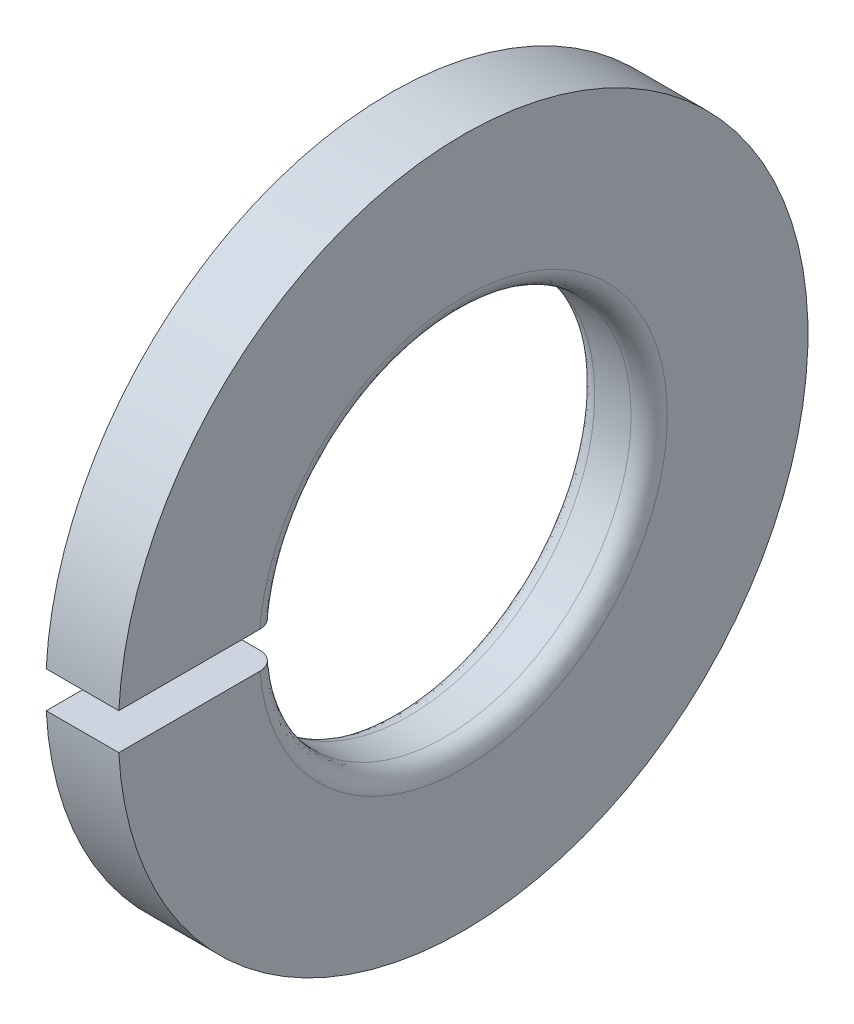
ISO-10303-21;
HEADER;
FILE_DESCRIPTION(('STEP AP214'),'2;1');
FILE_NAME('part.step','',(''),(''),'','','');
FILE_SCHEMA(('AUTOMOTIVE_DESIGN { 1 0 10303 214 1 1 1 1 }'));
ENDSEC;
DATA;
#1=APPLICATION_CONTEXT('core data for automotive mechanical design processes');
#2=APPLICATION_PROTOCOL_DEFINITION('international standard','automotive_design',2000,#1);
#3=PRODUCT_CONTEXT('',#1,'mechanical');
#4=PRODUCT('Part','Part','',(#3));
#5=PRODUCT_RELATED_PRODUCT_CATEGORY('part','',(#4));
#6=PRODUCT_DEFINITION_FORMATION('','',#4);
#7=PRODUCT_DEFINITION_CONTEXT('part definition',#1,'design');
#8=PRODUCT_DEFINITION('design','',#6,#7);
#9=PRODUCT_DEFINITION_SHAPE('','',#8);
#10=(LENGTH_UNIT() NAMED_UNIT(*) SI_UNIT(.MILLI.,.METRE.));
#11=(NAMED_UNIT(*) PLANE_ANGLE_UNIT() SI_UNIT($,.RADIAN.));
#12=(NAMED_UNIT(*) SI_UNIT($,.STERADIAN.) SOLID_ANGLE_UNIT());
#13=UNCERTAINTY_MEASURE_WITH_UNIT(LENGTH_MEASURE(1.E-05),#10,'distance_accuracy_value','');
#14=(GEOMETRIC_REPRESENTATION_CONTEXT(3) GLOBAL_UNCERTAINTY_ASSIGNED_CONTEXT((#13)) GLOBAL_UNIT_ASSIGNED_CONTEXT((#10,
#11,#12)) REPRESENTATION_CONTEXT('',''));
#15=CARTESIAN_POINT('',(0.,0.,0.));
#16=DIRECTION('',(0.,0.,1.));
#17=DIRECTION('',(1.,0.,0.));
#18=AXIS2_PLACEMENT_3D('',#15,#16,#17);
#19=CARTESIAN_POINT('',(-0.2,0.,0.));
#20=DIRECTION('',(-1.,0.,0.));
#21=DIRECTION('',(0.,0.,1.));
#22=AXIS2_PLACEMENT_3D('',#19,#20,#21);
#23=CYLINDRICAL_SURFACE('',#22,2.05);
#24=DIRECTION('',(-1.,0.,0.));
#25=VECTOR('',#24,1.);
#26=CARTESIAN_POINT('',(-0.4,-0.200000000674253,2.04022057624422));
#27=LINE('',#26,#25);
#28=CARTESIAN_POINT('',(-0.600000000000003,-0.200000000337126,2.04022057627727));
#29=VERTEX_POINT('',#28);
#30=CARTESIAN_POINT('',(-0.199999999999999,-0.200000000337126,2.04022057627727));
#31=VERTEX_POINT('',#30);
#32=EDGE_CURVE('E59',#29,#31,#27,.F.);
#33=ORIENTED_EDGE('',*,*,#32,.T.);
#34=CARTESIAN_POINT('',(-0.199999999999999,0.,0.));
#35=DIRECTION('',(-1.,0.,0.));
#36=DIRECTION('',(0.,0.,1.));
#37=AXIS2_PLACEMENT_3D('',#34,#35,#36);
#38=CIRCLE('',#37,2.05);
#39=CARTESIAN_POINT('',(-0.199999999999999,0.200000000153928,2.04022057629523));
#40=VERTEX_POINT('',#39);
#41=EDGE_CURVE('E69',#40,#31,#38,.T.);
#42=ORIENTED_EDGE('',*,*,#41,.F.);
#43=DIRECTION('',(1.,0.,0.));
#44=VECTOR('',#43,1.);
#45=CARTESIAN_POINT('',(-0.4,0.200000000307857,2.04022057628014));
#46=LINE('',#45,#44);
#47=CARTESIAN_POINT('',(-0.600000000074826,0.200000000153928,2.04022057616246));
#48=VERTEX_POINT('',#47);
#49=EDGE_CURVE('E64',#40,#48,#46,.F.);
#50=ORIENTED_EDGE('',*,*,#49,.T.);
#51=CARTESIAN_POINT('',(-0.600000000000003,0.,0.));
#52=DIRECTION('',(-1.,0.,0.));
#53=DIRECTION('',(0.,0.,1.));
#54=AXIS2_PLACEMENT_3D('',#51,#52,#53);
#55=CIRCLE('',#54,2.05);
#56=EDGE_CURVE('E21',#29,#48,#55,.F.);
#57=ORIENTED_EDGE('',*,*,#56,.F.);
#58=EDGE_LOOP('',(#33,#42,#50,#57));
#59=FACE_BOUND('',#58,.T.);
#60=ADVANCED_FACE('F16',(#59),#23,.F.);
#61=CARTESIAN_POINT('',(-0.580033317,0.107372646,2.048186685));
#62=CARTESIAN_POINT('',(-0.580033317,3.99856242,1.844197789));
#63=CARTESIAN_POINT('',(-0.580033317,3.896532989,-2.050999167));
#64=CARTESIAN_POINT('',(-0.580033317,0.,-2.050999167));
#65=CARTESIAN_POINT('',(-0.580033317,-3.896532989,-2.050999167));
#66=CARTESIAN_POINT('',(-0.580033317,-3.99856242,1.844197789));
#67=CARTESIAN_POINT('',(-0.580033317,-0.107372646,2.048186685));
#68=CARTESIAN_POINT('',(-0.716010753,0.106658403,2.034562142));
#69=CARTESIAN_POINT('',(-0.716010753,3.971963973,1.831930181));
#70=CARTESIAN_POINT('',(-0.716010753,3.870613242,-2.037355915));
#71=CARTESIAN_POINT('',(-0.716010753,0.,-2.037355915));
#72=CARTESIAN_POINT('',(-0.716010753,-3.870613242,-2.037355915));
#73=CARTESIAN_POINT('',(-0.716010753,-3.971963973,1.831930181));
#74=CARTESIAN_POINT('',(-0.716010753,-0.106658403,2.034562142));
#75=CARTESIAN_POINT('',(-0.812644085,0.111717291,2.131062963));
#76=CARTESIAN_POINT('',(-0.812644085,4.160357228,1.918820014));
#77=CARTESIAN_POINT('',(-0.812644085,4.054199354,-2.133989247));
#78=CARTESIAN_POINT('',(-0.812644085,0.,-2.133989247));
#79=CARTESIAN_POINT('',(-0.812644085,-4.054199354,-2.133989247));
#80=CARTESIAN_POINT('',(-0.812644085,-4.160357228,1.918820014));
#81=CARTESIAN_POINT('',(-0.812644085,-0.111717291,2.131062963));
#82=CARTESIAN_POINT('',(-0.799000833,0.118835898,2.266853937));
#83=CARTESIAN_POINT('',(-0.799000833,4.425454491,2.041086903));
#84=CARTESIAN_POINT('',(-0.799000833,4.312532256,-2.269966683));
#85=CARTESIAN_POINT('',(-0.799000833,0.,-2.269966683));
#86=CARTESIAN_POINT('',(-0.799000833,-4.312532256,-2.269966683));
#87=CARTESIAN_POINT('',(-0.799000833,-4.425454491,2.041086903));
#88=CARTESIAN_POINT('',(-0.799000833,-0.118835898,2.266853937));
#89=(BOUNDED_SURFACE() B_SPLINE_SURFACE(3,3,((#61,#62,#63,#64,#65,#66,#67),(#68,#69,#70,#71,#72,
#73,#74),(#75,#76,#77,#78,#79,#80,#81),(#82,#83,#84,#85,#86,#87,#88)),.UNSPECIFIED.,.F.,.F.,
.F.) B_SPLINE_SURFACE_WITH_KNOTS((4,4),(4,3,4),(0.,1.),(0.,0.5,1.),
.UNSPECIFIED.) GEOMETRIC_REPRESENTATION_ITEM() RATIONAL_B_SPLINE_SURFACE(((1.,0.350789780215431,
0.350789780215431,1.,0.350789780215431,0.350789780215431,1.),(0.755320871117959,
0.264958842371597,0.264958842371597,0.755320871117959,0.264958842371597,0.264958842371597,
0.755320871117959),(0.755320871117959,0.264958842371597,0.264958842371597,0.755320871117959,
0.264958842371597,0.264958842371597,0.755320871117959),(1.,0.350789780215431,0.350789780215431,
1.,0.350789780215431,0.350789780215431,1.))) REPRESENTATION_ITEM('') SURFACE());
#90=CARTESIAN_POINT('',(-0.800000000011606,0.117790614492978,2.24691463337642));
#91=CARTESIAN_POINT('',(-0.800000000011607,4.3865280832893,2.02313345182409));
#92=CARTESIAN_POINT('',(-0.800000000011607,4.27459911496978,-2.24999999962598));
#93=CARTESIAN_POINT('',(-0.800000000011606,0.,-2.24999999962598));
#94=CARTESIAN_POINT('',(-0.800000000011607,-4.27459911496978,-2.24999999962598));
#95=CARTESIAN_POINT('',(-0.800000000011607,-4.3865280832893,2.02313345182409));
#96=CARTESIAN_POINT('',(-0.800000000011606,-0.117790614492978,2.24691463337642));
#97=(BOUNDED_CURVE() B_SPLINE_CURVE(3,(#90,#91,#92,#93,#94,#95,#96),.UNSPECIFIED.,.F.,
.F.) B_SPLINE_CURVE_WITH_KNOTS((4,3,4),(0.,0.5,1.),
.UNSPECIFIED.) CURVE() GEOMETRIC_REPRESENTATION_ITEM() RATIONAL_B_SPLINE_CURVE((0.956578302165992,
0.335557892375659,0.335557892375659,0.956578302165992,0.335557892375659,0.335557892375659,0.956578302165992)) REPRESENTATION_ITEM(''));
#98=CARTESIAN_POINT('',(-0.800000000004642,0.200000001463602,2.2410934830574));
#99=VERTEX_POINT('',#98);
#100=CARTESIAN_POINT('',(-0.800000000004642,-0.200000001463602,2.2410934830574));
#101=VERTEX_POINT('',#100);
#102=EDGE_CURVE('E95',#99,#101,#97,.T.);
#103=CARTESIAN_POINT('',(-0.800000000011606,-0.2,2.2410934830574));
#104=CARTESIAN_POINT('',(-0.800009380586033,-0.199999999999992,2.22975892295394));
#105=CARTESIAN_POINT('',(-0.799044625498886,-0.199999999999996,2.21842707761932));
#106=CARTESIAN_POINT('',(-0.795236578345557,-0.200000000000004,2.19609110441703));
#107=CARTESIAN_POINT('',(-0.792394568560642,-0.200000000000008,2.18508675820541));
#108=CARTESIAN_POINT('',(-0.784899682227042,-0.199999999999992,2.16370635476711));
#109=CARTESIAN_POINT('',(-0.780245893178928,-0.199999999999973,2.15333061718592));
#110=CARTESIAN_POINT('',(-0.769261427341696,-0.200000000000027,2.1335110976004));
#111=CARTESIAN_POINT('',(-0.762931087375522,-0.200000000000102,2.12406712892404));
#112=CARTESIAN_POINT('',(-0.748779665680255,-0.199999999999919,2.10639256306883));
#113=CARTESIAN_POINT('',(-0.740960651674507,-0.199999999999662,2.09816031064719));
#114=CARTESIAN_POINT('',(-0.724046583349223,-0.200000000000338,2.08313205676974));
#115=CARTESIAN_POINT('',(-0.714951597324807,-0.200000000001272,2.07633597849292));
#116=CARTESIAN_POINT('',(-0.695780628589884,-0.200000000001267,2.06440051765539));
#117=CARTESIAN_POINT('',(-0.685708397878414,-0.200000000000336,2.05925510172876));
#118=CARTESIAN_POINT('',(-0.664842681734056,-0.199999999999664,2.05073950165837));
#119=CARTESIAN_POINT('',(-0.654049672079823,-0.199999999999922,2.0473681592676));
#120=CARTESIAN_POINT('',(-0.635988100638602,-0.200000000000049,2.04336664836853));
#121=CARTESIAN_POINT('',(-0.62883642124079,-0.200000000000025,2.04218759083578));
#122=CARTESIAN_POINT('',(-0.614457531604958,-0.199999999999975,2.04061467862908));
#123=CARTESIAN_POINT('',(-0.607230442982398,-0.199999999999951,2.04021971182569));
#124=CARTESIAN_POINT('',(-0.60000000014965,-0.2,2.04022057604478));
#125=B_SPLINE_CURVE_WITH_KNOTS('',3,(#103,#104,#105,#106,#107,#108,#109,#110,#111,#112,#113,
#114,#115,#116,#117,#118,#119,#120,#121,#122,#123,#124),.UNSPECIFIED.,.F.,.F.,(4,2,2,2,2,2,2,2,
2,2,4),(0.,0.0339588559577191,0.0678945398666436,0.101847337580276,0.13579331926613,
0.169692490514159,0.203589848034817,0.237361856441742,0.271111788530929,0.292816611636757,
0.314490627251309),.UNSPECIFIED.);
#126=EDGE_CURVE('E82',#101,#29,#125,.T.);
#127=CARTESIAN_POINT('',(-0.60000000014965,0.2,2.04022057604478));
#128=CARTESIAN_POINT('',(-0.611213909457987,0.199999999999997,2.04021077519078));
#129=CARTESIAN_POINT('',(-0.622424615497118,0.199999999999998,2.04116764000537));
#130=CARTESIAN_POINT('',(-0.644518092358117,0.200000000000002,2.04494195310485));
#131=CARTESIAN_POINT('',(-0.65540115803218,0.200000000000003,2.0477576728358));
#132=CARTESIAN_POINT('',(-0.67654434962043,0.199999999999997,2.05517878927597));
#133=CARTESIAN_POINT('',(-0.68680420578501,0.199999999999988,2.05978495466734));
#134=CARTESIAN_POINT('',(-0.70640604369611,0.200000000000012,2.07064933392915));
#135=CARTESIAN_POINT('',(-0.715748148567725,0.200000000000043,2.07690732577483));
#136=CARTESIAN_POINT('',(-0.733275218600097,0.200000000000006,2.09091265094623));
#137=CARTESIAN_POINT('',(-0.741457465212266,0.199999999999936,2.098663386032));
#138=CARTESIAN_POINT('',(-0.756411664005744,0.200000000000064,2.11542335985753));
#139=CARTESIAN_POINT('',(-0.763183587003915,0.200000000000262,2.124432624633));
#140=CARTESIAN_POINT('',(-0.775158014487504,0.200000000000266,2.14349811162961));
#141=CARTESIAN_POINT('',(-0.780352993290512,0.200000000000071,2.15355905543216));
#142=CARTESIAN_POINT('',(-0.788984604287231,0.199999999999929,2.17440629699856));
#143=CARTESIAN_POINT('',(-0.792422171619997,0.199999999999983,2.18519220553573));
#144=CARTESIAN_POINT('',(-0.796617458847842,0.200000000000011,2.20354834557991));
#145=CARTESIAN_POINT('',(-0.797885078988491,0.200000000000006,2.21100609621852));
#146=CARTESIAN_POINT('',(-0.799576268230461,0.199999999999994,2.22600604365994));
#147=CARTESIAN_POINT('',(-0.800001021732336,0.199999999999989,2.23354810696728));
#148=CARTESIAN_POINT('',(-0.800000000011606,0.2,2.2410934830574));
#149=B_SPLINE_CURVE_WITH_KNOTS('',3,(#127,#128,#129,#130,#131,#132,#133,#134,#135,#136,#137,
#138,#139,#140,#141,#142,#143,#144,#145,#146,#147,#148),.UNSPECIFIED.,.F.,.F.,(4,2,2,2,2,2,2,2,
2,2,4),(0.,0.0335963217129075,0.067161446043312,0.100740996647746,0.134316036065029,
0.167968513692015,0.201621687604119,0.235433027798897,0.269226357811702,0.291875956380084,
0.314493705013647),.UNSPECIFIED.);
#150=EDGE_CURVE('E76',#48,#99,#149,.T.);
#151=ORIENTED_EDGE('',*,*,#102,.T.);
#152=ORIENTED_EDGE('',*,*,#126,.T.);
#153=ORIENTED_EDGE('',*,*,#56,.T.);
#154=ORIENTED_EDGE('',*,*,#150,.T.);
#155=EDGE_LOOP('',(#151,#152,#153,#154));
#156=FACE_BOUND('',#155,.T.);
#157=ADVANCED_FACE('F84',(#156),#89,.T.);
#158=CARTESIAN_POINT('',(-0.000999167000000001,0.118835898,2.266853937));
#159=CARTESIAN_POINT('',(-0.000999167000000001,4.425454491,2.041086903));
#160=CARTESIAN_POINT('',(-0.000999167000000001,4.312532256,-2.269966683));
#161=CARTESIAN_POINT('',(-0.000999167000000001,0.,-2.269966683));
#162=CARTESIAN_POINT('',(-0.000999167000000001,-4.312532256,-2.269966683));
#163=CARTESIAN_POINT('',(-0.000999167000000001,-4.425454491,2.041086903));
#164=CARTESIAN_POINT('',(-0.000999167000000001,-0.118835898,2.266853937));
#165=CARTESIAN_POINT('',(0.012644085,0.111717291,2.131062963));
#166=CARTESIAN_POINT('',(0.012644085,4.160357228,1.918820014));
#167=CARTESIAN_POINT('',(0.012644085,4.054199354,-2.133989247));
#168=CARTESIAN_POINT('',(0.012644085,0.,-2.133989247));
#169=CARTESIAN_POINT('',(0.012644085,-4.054199354,-2.133989247));
#170=CARTESIAN_POINT('',(0.012644085,-4.160357228,1.918820014));
#171=CARTESIAN_POINT('',(0.012644085,-0.111717291,2.131062963));
#172=CARTESIAN_POINT('',(-0.083989247,0.106658403,2.034562142));
#173=CARTESIAN_POINT('',(-0.083989247,3.971963973,1.831930181));
#174=CARTESIAN_POINT('',(-0.083989247,3.870613242,-2.037355915));
#175=CARTESIAN_POINT('',(-0.083989247,0.,-2.037355915));
#176=CARTESIAN_POINT('',(-0.083989247,-3.870613242,-2.037355915));
#177=CARTESIAN_POINT('',(-0.083989247,-3.971963973,1.831930181));
#178=CARTESIAN_POINT('',(-0.083989247,-0.106658403,2.034562142));
#179=CARTESIAN_POINT('',(-0.219966683,0.107372646,2.048186685));
#180=CARTESIAN_POINT('',(-0.219966683,3.99856242,1.844197789));
#181=CARTESIAN_POINT('',(-0.219966683,3.896532989,-2.050999167));
#182=CARTESIAN_POINT('',(-0.219966683,0.,-2.050999167));
#183=CARTESIAN_POINT('',(-0.219966683,-3.896532989,-2.050999167));
#184=CARTESIAN_POINT('',(-0.219966683,-3.99856242,1.844197789));
#185=CARTESIAN_POINT('',(-0.219966683,-0.107372646,2.048186685));
#186=(BOUNDED_SURFACE() B_SPLINE_SURFACE(3,3,((#158,#159,#160,#161,#162,#163,#164),(#165,#166,
#167,#168,#169,#170,#171),(#172,#173,#174,#175,#176,#177,#178),(#179,#180,#181,#182,#183,#184,
#185)),.UNSPECIFIED.,.F.,.F.,.F.) B_SPLINE_SURFACE_WITH_KNOTS((4,4),(4,3,4),(0.,1.),(0.,0.5,1.),
.UNSPECIFIED.) GEOMETRIC_REPRESENTATION_ITEM() RATIONAL_B_SPLINE_SURFACE(((1.,0.350789780215431,
0.350789780215431,1.,0.350789780215431,0.350789780215431,1.),(0.755320871117974,
0.264958842371602,0.264958842371602,0.755320871117974,0.264958842371602,0.264958842371602,
0.755320871117974),(0.755320871117974,0.264958842371602,0.264958842371602,0.755320871117974,
0.264958842371602,0.264958842371602,0.755320871117974),(1.,0.350789780215431,0.350789780215431,
1.,0.350789780215431,0.350789780215431,1.))) REPRESENTATION_ITEM('') SURFACE());
#187=CARTESIAN_POINT('',(1.16062016502921E-11,-0.199999999999999,2.24109348315148));
#188=CARTESIAN_POINT('',(9.38059132239464E-06,-0.199999999999984,2.22975892304799));
#189=CARTESIAN_POINT('',(-0.000955374490542313,-0.199999999999992,2.21842707771289));
#190=CARTESIAN_POINT('',(-0.00476342163346842,-0.200000000000008,2.19609110450876));
#191=CARTESIAN_POINT('',(-0.00760543141326144,-0.200000000000016,2.18508675829579));
#192=CARTESIAN_POINT('',(-0.0151003177369134,-0.199999999999984,2.16370635485396));
#193=CARTESIAN_POINT('',(-0.0197541067802001,-0.199999999999945,2.15333061727057));
#194=CARTESIAN_POINT('',(-0.0307385726082152,-0.200000000000055,2.13351109767988));
#195=CARTESIAN_POINT('',(-0.0370689125699999,-0.200000000000205,2.12406712900054));
#196=CARTESIAN_POINT('',(-0.051220334257065,-0.199999999999838,2.10639256313867));
#197=CARTESIAN_POINT('',(-0.0590393482590025,-0.199999999999324,2.09816031071334));
#198=CARTESIAN_POINT('',(-0.0759534165773405,-0.200000000000676,2.08313205682792));
#199=CARTESIAN_POINT('',(-0.0850484025986199,-0.200000000002544,2.07633597854682));
#200=CARTESIAN_POINT('',(-0.104219371328054,-0.200000000002535,2.06440051770028));
#201=CARTESIAN_POINT('',(-0.114291602037168,-0.200000000000673,2.05925510176891));
#202=CARTESIAN_POINT('',(-0.135157318177666,-0.199999999999328,2.05073950168871));
#203=CARTESIAN_POINT('',(-0.145950327830398,-0.199999999999844,2.04736815929287));
#204=CARTESIAN_POINT('',(-0.164011899284985,-0.200000000000099,2.043366648382));
#205=CARTESIAN_POINT('',(-0.171163578697742,-0.20000000000005,2.04218759084421));
#206=CARTESIAN_POINT('',(-0.185542468364025,-0.19999999999995,2.04061467863077));
#207=CARTESIAN_POINT('',(-0.192769557002092,-0.199999999999901,2.04021971182568));
#208=CARTESIAN_POINT('',(-0.199999999850351,-0.200000000000001,2.04022057604478));
#209=B_SPLINE_CURVE_WITH_KNOTS('',3,(#187,#188,#189,#190,#191,#192,#193,#194,#195,#196,#197,
#198,#199,#200,#201,#202,#203,#204,#205,#206,#207,#208),.UNSPECIFIED.,.F.,.F.,(4,2,2,2,2,2,2,2,
2,2,4),(0.,0.0339588559578118,0.067894539866816,0.101847337580524,0.135793319266466,
0.169692490514643,0.203589848035453,0.237361856442534,0.271111788531991,0.292816611684237,
0.314490627345246),.UNSPECIFIED.);
#210=CARTESIAN_POINT('',(4.64248130664176E-12,-0.200000002172402,2.24109348315148));
#211=VERTEX_POINT('',#210);
#212=EDGE_CURVE('E176',#211,#31,#209,.T.);
#213=CARTESIAN_POINT('',(1.16062031834229E-11,-0.117790614492978,2.24691463337642));
#214=CARTESIAN_POINT('',(1.16062031743743E-11,-4.3865280832893,2.02313345182409));
#215=CARTESIAN_POINT('',(1.16062031743743E-11,-4.27459911496978,-2.24999999962598));
#216=CARTESIAN_POINT('',(1.16062031834229E-11,0.,-2.24999999962598));
#217=CARTESIAN_POINT('',(1.16062031743743E-11,4.27459911496978,-2.24999999962598));
#218=CARTESIAN_POINT('',(1.16062031743743E-11,4.3865280832893,2.02313345182409));
#219=CARTESIAN_POINT('',(1.16062031834229E-11,0.117790614492978,2.24691463337642));
#220=(BOUNDED_CURVE() B_SPLINE_CURVE(3,(#213,#214,#215,#216,#217,#218,#219),.UNSPECIFIED.,.F.,
.F.) B_SPLINE_CURVE_WITH_KNOTS((4,3,4),(0.,0.5,1.),
.UNSPECIFIED.) CURVE() GEOMETRIC_REPRESENTATION_ITEM() RATIONAL_B_SPLINE_CURVE((0.956578302165994,
0.335557892375659,0.335557892375659,0.956578302165994,0.335557892375659,0.335557892375659,0.956578302165994)) REPRESENTATION_ITEM(''));
#221=CARTESIAN_POINT('',(4.64248130664176E-12,0.200000001463602,2.2410934830574));
#222=VERTEX_POINT('',#221);
#223=EDGE_CURVE('E185',#211,#222,#220,.T.);
#224=CARTESIAN_POINT('',(1.16062023035901E-11,0.2,2.2410934830574));
#225=CARTESIAN_POINT('',(9.38058603285607E-06,0.199999999999992,2.22975892295394));
#226=CARTESIAN_POINT('',(-0.000955374501114946,0.199999999999996,2.21842707761931));
#227=CARTESIAN_POINT('',(-0.0047634216544488,0.200000000000004,2.196091104417));
#228=CARTESIAN_POINT('',(-0.00760543143936731,0.200000000000008,2.18508675820537));
#229=CARTESIAN_POINT('',(-0.0151003177729766,0.199999999999992,2.16370635476707));
#230=CARTESIAN_POINT('',(-0.0197541068210951,0.199999999999972,2.15333061718587));
#231=CARTESIAN_POINT('',(-0.03073857265834,0.200000000000028,2.13351109760034));
#232=CARTESIAN_POINT('',(-0.0370689126245222,0.200000000000102,2.12406712892398));
#233=CARTESIAN_POINT('',(-0.0512203343198005,0.199999999999919,2.10639256306877));
#234=CARTESIAN_POINT('',(-0.0590393483255508,0.199999999999662,2.09816031064713));
#235=CARTESIAN_POINT('',(-0.075953416650841,0.200000000000338,2.08313205676969));
#236=CARTESIAN_POINT('',(-0.0850484026752595,0.200000000001272,2.07633597849287));
#237=CARTESIAN_POINT('',(-0.104219371410188,0.200000000001267,2.06440051765536));
#238=CARTESIAN_POINT('',(-0.114291602121659,0.200000000000336,2.05925510172873));
#239=CARTESIAN_POINT('',(-0.135157318266021,0.199999999999664,2.05073950165834));
#240=CARTESIAN_POINT('',(-0.145950327920256,0.199999999999923,2.04736815926758));
#241=CARTESIAN_POINT('',(-0.164011899361465,0.20000000000005,2.04336664836852));
#242=CARTESIAN_POINT('',(-0.171163578759265,0.200000000000025,2.04218759083578));
#243=CARTESIAN_POINT('',(-0.18554246839507,0.199999999999975,2.04061467862908));
#244=CARTESIAN_POINT('',(-0.192769557017617,0.19999999999995,2.04021971182569));
#245=CARTESIAN_POINT('',(-0.199999999850351,0.2,2.04022057604478));
#246=B_SPLINE_CURVE_WITH_KNOTS('',3,(#224,#225,#226,#227,#228,#229,#230,#231,#232,#233,#234,
#235,#236,#237,#238,#239,#240,#241,#242,#243,#244,#245),.UNSPECIFIED.,.F.,.F.,(4,2,2,2,2,2,2,2,
2,2,4),(0.,0.0339588559577397,0.0678945398666848,0.101847337580337,0.135793319266211,
0.16969249051424,0.203589848034898,0.237361856441822,0.27111178853101,0.292816611636798,
0.314490627251309),.UNSPECIFIED.);
#247=EDGE_CURVE('E209',#222,#40,#246,.T.);
#248=ORIENTED_EDGE('',*,*,#41,.T.);
#249=ORIENTED_EDGE('',*,*,#212,.F.);
#250=ORIENTED_EDGE('',*,*,#223,.T.);
#251=ORIENTED_EDGE('',*,*,#247,.T.);
#252=EDGE_LOOP('',(#248,#249,#250,#251));
#253=FACE_BOUND('',#252,.T.);
#254=ADVANCED_FACE('F113',(#253),#186,.T.);
#255=CARTESIAN_POINT('',(-0.8,-3.8456,3.840301591));
#256=DIRECTION('',(1.,0.,0.));
#257=DIRECTION('',(0.,0.,-1.));
#258=AXIS2_PLACEMENT_3D('',#255,#256,#257);
#259=PLANE('',#258);
#260=CARTESIAN_POINT('',(-0.800000000000002,0.,0.));
#261=DIRECTION('',(-1.,0.,0.));
#262=DIRECTION('',(0.,0.,1.));
#263=AXIS2_PLACEMENT_3D('',#260,#261,#262);
#264=CIRCLE('',#263,3.8);
#265=CARTESIAN_POINT('',(-0.800000000000002,0.199999999503706,3.79473319222821));
#266=VERTEX_POINT('',#265);
#267=CARTESIAN_POINT('',(-0.800000000000002,-0.199999999844446,3.79473319221025));
#268=VERTEX_POINT('',#267);
#269=EDGE_CURVE('E180',#266,#268,#264,.T.);
#270=ORIENTED_EDGE('',*,*,#269,.T.);
#271=DIRECTION('',(0.,0.,1.));
#272=VECTOR('',#271,1.);
#273=CARTESIAN_POINT('',(-0.8,-0.2,2.917476884));
#274=LINE('',#273,#272);
#275=EDGE_CURVE('E178',#101,#268,#274,.T.);
#276=ORIENTED_EDGE('',*,*,#275,.F.);
#277=ORIENTED_EDGE('',*,*,#102,.F.);
#278=DIRECTION('',(0.,0.,-1.));
#279=VECTOR('',#278,1.);
#280=CARTESIAN_POINT('',(-0.8,0.2,2.917476884));
#281=LINE('',#280,#279);
#282=EDGE_CURVE('E78',#266,#99,#281,.T.);
#283=ORIENTED_EDGE('',*,*,#282,.F.);
#284=EDGE_LOOP('',(#270,#276,#277,#283));
#285=FACE_BOUND('',#284,.T.);
#286=ADVANCED_FACE('F102',(#285),#259,.F.);
#287=CARTESIAN_POINT('',(-0.8,-0.2,2.040220576));
#288=DIRECTION('',(0.,1.,0.));
#289=DIRECTION('',(0.,0.,1.));
#290=AXIS2_PLACEMENT_3D('',#287,#288,#289);
#291=PLANE('',#290);
#292=ORIENTED_EDGE('',*,*,#126,.F.);
#293=ORIENTED_EDGE('',*,*,#275,.T.);
#294=DIRECTION('',(-1.,0.,0.));
#295=VECTOR('',#294,1.);
#296=CARTESIAN_POINT('',(-0.4,-0.199999999688892,3.79473319221845));
#297=LINE('',#296,#295);
#298=CARTESIAN_POINT('',(0.,-0.200000001616446,3.79473319211686));
#299=VERTEX_POINT('',#298);
#300=EDGE_CURVE('E189',#268,#299,#297,.F.);
#301=ORIENTED_EDGE('',*,*,#300,.T.);
#302=DIRECTION('',(0.,0.,-1.));
#303=VECTOR('',#302,1.);
#304=CARTESIAN_POINT('',(0.,-0.200000003544,-0.00263340399999962));
#305=LINE('',#304,#303);
#306=EDGE_CURVE('E182',#299,#211,#305,.T.);
#307=ORIENTED_EDGE('',*,*,#306,.T.);
#308=ORIENTED_EDGE('',*,*,#212,.T.);
#309=ORIENTED_EDGE('',*,*,#32,.F.);
#310=EDGE_LOOP('',(#292,#293,#301,#307,#308,#309));
#311=FACE_BOUND('',#310,.T.);
#312=ADVANCED_FACE('F112',(#311),#291,.T.);
#313=CARTESIAN_POINT('',(0.,-3.8456,-3.845568399));
#314=DIRECTION('',(-1.,0.,0.));
#315=DIRECTION('',(0.,0.,1.));
#316=AXIS2_PLACEMENT_3D('',#313,#314,#315);
#317=PLANE('',#316);
#318=ORIENTED_EDGE('',*,*,#223,.F.);
#319=ORIENTED_EDGE('',*,*,#306,.F.);
#320=CARTESIAN_POINT('',(0.,0.,0.));
#321=DIRECTION('',(-1.,0.,0.));
#322=DIRECTION('',(0.,0.,1.));
#323=AXIS2_PLACEMENT_3D('',#320,#321,#322);
#324=CIRCLE('',#323,3.8);
#325=CARTESIAN_POINT('',(0.,0.199999999503706,3.79473319222821));
#326=VERTEX_POINT('',#325);
#327=EDGE_CURVE('E27',#299,#326,#324,.F.);
#328=ORIENTED_EDGE('',*,*,#327,.T.);
#329=DIRECTION('',(0.,0.,1.));
#330=VECTOR('',#329,1.);
#331=CARTESIAN_POINT('',(0.,0.2,2.917476884));
#332=LINE('',#331,#330);
#333=EDGE_CURVE('E196',#222,#326,#332,.T.);
#334=ORIENTED_EDGE('',*,*,#333,.F.);
#335=EDGE_LOOP('',(#318,#319,#328,#334));
#336=FACE_BOUND('',#335,.T.);
#337=ADVANCED_FACE('F116',(#336),#317,.F.);
#338=CARTESIAN_POINT('',(-0.8,0.2,3.794733192));
#339=DIRECTION('',(0.,-1.,0.));
#340=DIRECTION('',(0.,0.,-1.));
#341=AXIS2_PLACEMENT_3D('',#338,#339,#340);
#342=PLANE('',#341);
#343=ORIENTED_EDGE('',*,*,#247,.F.);
#344=ORIENTED_EDGE('',*,*,#333,.T.);
#345=DIRECTION('',(1.,0.,0.));
#346=VECTOR('',#345,1.);
#347=CARTESIAN_POINT('',(-0.4,0.199999999007412,3.79473319225437));
#348=LINE('',#347,#346);
#349=EDGE_CURVE('E11',#326,#266,#348,.F.);
#350=ORIENTED_EDGE('',*,*,#349,.T.);
#351=ORIENTED_EDGE('',*,*,#282,.T.);
#352=ORIENTED_EDGE('',*,*,#150,.F.);
#353=ORIENTED_EDGE('',*,*,#49,.F.);
#354=EDGE_LOOP('',(#343,#344,#350,#351,#352,#353));
#355=FACE_BOUND('',#354,.T.);
#356=ADVANCED_FACE('F18',(#355),#342,.T.);
#357=CARTESIAN_POINT('',(0.,0.,0.));
#358=DIRECTION('',(-1.,0.,0.));
#359=DIRECTION('',(0.,0.,1.));
#360=AXIS2_PLACEMENT_3D('',#357,#358,#359);
#361=CYLINDRICAL_SURFACE('',#360,3.8);
#362=ORIENTED_EDGE('',*,*,#327,.F.);
#363=ORIENTED_EDGE('',*,*,#300,.F.);
#364=ORIENTED_EDGE('',*,*,#269,.F.);
#365=ORIENTED_EDGE('',*,*,#349,.F.);
#366=EDGE_LOOP('',(#362,#363,#364,#365));
#367=FACE_BOUND('',#366,.T.);
#368=ADVANCED_FACE('F155',(#367),#361,.T.);
#369=CLOSED_SHELL('',(#60,#157,#254,#286,#312,#337,#356,#368));
#370=MANIFOLD_SOLID_BREP('B1',#369);
#371=ADVANCED_BREP_SHAPE_REPRESENTATION('',(#18,#370),#14);
#372=SHAPE_DEFINITION_REPRESENTATION(#9,#371);
ENDSEC;
END-ISO-10303-21;
